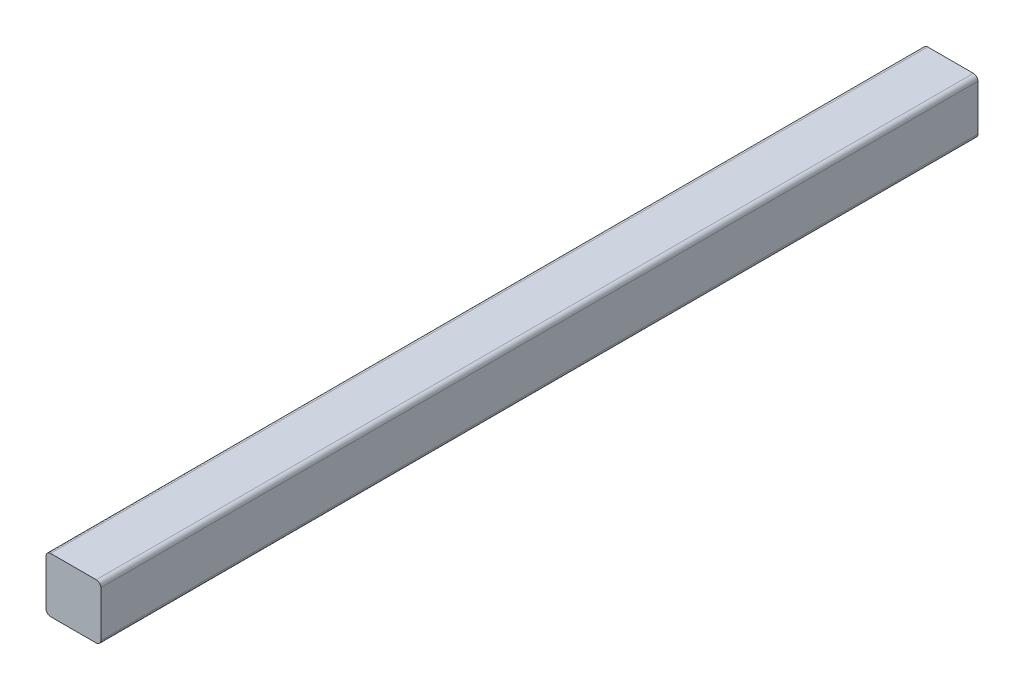
ISO-10303-21;
HEADER;
FILE_DESCRIPTION(('STEP AP214'),'2;1');
FILE_NAME('part.step','',(''),(''),'','','');
FILE_SCHEMA(('AUTOMOTIVE_DESIGN { 1 0 10303 214 1 1 1 1 }'));
ENDSEC;
DATA;
#1=APPLICATION_CONTEXT('core data for automotive mechanical design processes');
#2=APPLICATION_PROTOCOL_DEFINITION('international standard','automotive_design',2000,#1);
#3=PRODUCT_CONTEXT('',#1,'mechanical');
#4=PRODUCT('Part','Part','',(#3));
#5=PRODUCT_RELATED_PRODUCT_CATEGORY('part','',(#4));
#6=PRODUCT_DEFINITION_FORMATION('','',#4);
#7=PRODUCT_DEFINITION_CONTEXT('part definition',#1,'design');
#8=PRODUCT_DEFINITION('design','',#6,#7);
#9=PRODUCT_DEFINITION_SHAPE('','',#8);
#10=(LENGTH_UNIT() NAMED_UNIT(*) SI_UNIT(.MILLI.,.METRE.));
#11=(NAMED_UNIT(*) PLANE_ANGLE_UNIT() SI_UNIT($,.RADIAN.));
#12=(NAMED_UNIT(*) SI_UNIT($,.STERADIAN.) SOLID_ANGLE_UNIT());
#13=UNCERTAINTY_MEASURE_WITH_UNIT(LENGTH_MEASURE(1.E-05),#10,'distance_accuracy_value','');
#14=(GEOMETRIC_REPRESENTATION_CONTEXT(3) GLOBAL_UNCERTAINTY_ASSIGNED_CONTEXT((#13)) GLOBAL_UNIT_ASSIGNED_CONTEXT((#10,
#11,#12)) REPRESENTATION_CONTEXT('',''));
#15=CARTESIAN_POINT('',(0.,0.,0.));
#16=DIRECTION('',(0.,0.,1.));
#17=DIRECTION('',(1.,0.,0.));
#18=AXIS2_PLACEMENT_3D('',#15,#16,#17);
#19=CARTESIAN_POINT('',(19.05,-19.05,609.6));
#20=DIRECTION('',(-1.,0.,0.));
#21=DIRECTION('',(0.,0.,1.));
#22=AXIS2_PLACEMENT_3D('',#19,#20,#21);
#23=PLANE('',#22);
#24=DIRECTION('',(0.,1.,0.));
#25=VECTOR('',#24,1.);
#26=CARTESIAN_POINT('',(19.05,-19.05,609.6));
#27=LINE('',#26,#25);
#28=CARTESIAN_POINT('',(19.05,-15.875,609.6));
#29=VERTEX_POINT('',#28);
#30=CARTESIAN_POINT('',(19.05,15.875,609.6));
#31=VERTEX_POINT('',#30);
#32=EDGE_CURVE('E134',#29,#31,#27,.T.);
#33=ORIENTED_EDGE('',*,*,#32,.F.);
#34=DIRECTION('',(0.,0.,-1.));
#35=VECTOR('',#34,1.);
#36=CARTESIAN_POINT('',(19.05,-15.875,609.6));
#37=LINE('',#36,#35);
#38=CARTESIAN_POINT('',(19.05,-15.875,0.));
#39=VERTEX_POINT('',#38);
#40=EDGE_CURVE('E11',#29,#39,#37,.T.);
#41=ORIENTED_EDGE('',*,*,#40,.T.);
#42=DIRECTION('',(0.,1.,0.));
#43=VECTOR('',#42,1.);
#44=CARTESIAN_POINT('',(19.05,-19.05,0.));
#45=LINE('',#44,#43);
#46=CARTESIAN_POINT('',(19.05,15.875,0.));
#47=VERTEX_POINT('',#46);
#48=EDGE_CURVE('E136',#39,#47,#45,.T.);
#49=ORIENTED_EDGE('',*,*,#48,.T.);
#50=DIRECTION('',(0.,0.,-1.));
#51=VECTOR('',#50,1.);
#52=CARTESIAN_POINT('',(19.05,15.875,609.6));
#53=LINE('',#52,#51);
#54=EDGE_CURVE('E47',#47,#31,#53,.F.);
#55=ORIENTED_EDGE('',*,*,#54,.T.);
#56=EDGE_LOOP('',(#33,#41,#49,#55));
#57=FACE_BOUND('',#56,.T.);
#58=ADVANCED_FACE('F39',(#57),#23,.F.);
#59=CARTESIAN_POINT('',(-19.05,19.05,609.6));
#60=DIRECTION('',(0.,-1.,0.));
#61=DIRECTION('',(0.,0.,-1.));
#62=AXIS2_PLACEMENT_3D('',#59,#60,#61);
#63=PLANE('',#62);
#64=DIRECTION('',(-1.,0.,0.));
#65=VECTOR('',#64,1.);
#66=CARTESIAN_POINT('',(-19.05,19.05,0.));
#67=LINE('',#66,#65);
#68=CARTESIAN_POINT('',(15.875,19.05,0.));
#69=VERTEX_POINT('',#68);
#70=CARTESIAN_POINT('',(-15.875,19.05,0.));
#71=VERTEX_POINT('',#70);
#72=EDGE_CURVE('E132',#69,#71,#67,.T.);
#73=ORIENTED_EDGE('',*,*,#72,.T.);
#74=DIRECTION('',(0.,0.,-1.));
#75=VECTOR('',#74,1.);
#76=CARTESIAN_POINT('',(-15.875,19.05,609.6));
#77=LINE('',#76,#75);
#78=CARTESIAN_POINT('',(-15.875,19.05,609.6));
#79=VERTEX_POINT('',#78);
#80=EDGE_CURVE('E111',#71,#79,#77,.F.);
#81=ORIENTED_EDGE('',*,*,#80,.T.);
#82=DIRECTION('',(-1.,0.,0.));
#83=VECTOR('',#82,1.);
#84=CARTESIAN_POINT('',(-19.05,19.05,609.6));
#85=LINE('',#84,#83);
#86=CARTESIAN_POINT('',(15.875,19.05,609.6));
#87=VERTEX_POINT('',#86);
#88=EDGE_CURVE('E172',#87,#79,#85,.T.);
#89=ORIENTED_EDGE('',*,*,#88,.F.);
#90=DIRECTION('',(0.,0.,-1.));
#91=VECTOR('',#90,1.);
#92=CARTESIAN_POINT('',(15.875,19.05,609.6));
#93=LINE('',#92,#91);
#94=EDGE_CURVE('E116',#87,#69,#93,.T.);
#95=ORIENTED_EDGE('',*,*,#94,.T.);
#96=EDGE_LOOP('',(#73,#81,#89,#95));
#97=FACE_BOUND('',#96,.T.);
#98=ADVANCED_FACE('F176',(#97),#63,.F.);
#99=CARTESIAN_POINT('',(-19.05,-19.05,609.6));
#100=DIRECTION('',(1.,0.,0.));
#101=DIRECTION('',(0.,0.,-1.));
#102=AXIS2_PLACEMENT_3D('',#99,#100,#101);
#103=PLANE('',#102);
#104=DIRECTION('',(0.,-1.,0.));
#105=VECTOR('',#104,1.);
#106=CARTESIAN_POINT('',(-19.05,-19.05,609.6));
#107=LINE('',#106,#105);
#108=CARTESIAN_POINT('',(-19.05,15.875,609.6));
#109=VERTEX_POINT('',#108);
#110=CARTESIAN_POINT('',(-19.05,-15.875,609.6));
#111=VERTEX_POINT('',#110);
#112=EDGE_CURVE('E125',#109,#111,#107,.T.);
#113=ORIENTED_EDGE('',*,*,#112,.F.);
#114=DIRECTION('',(0.,0.,-1.));
#115=VECTOR('',#114,1.);
#116=CARTESIAN_POINT('',(-19.05,15.875,609.6));
#117=LINE('',#116,#115);
#118=CARTESIAN_POINT('',(-19.05,15.875,0.));
#119=VERTEX_POINT('',#118);
#120=EDGE_CURVE('E110',#109,#119,#117,.T.);
#121=ORIENTED_EDGE('',*,*,#120,.T.);
#122=DIRECTION('',(0.,-1.,0.));
#123=VECTOR('',#122,1.);
#124=CARTESIAN_POINT('',(-19.05,-19.05,0.));
#125=LINE('',#124,#123);
#126=CARTESIAN_POINT('',(-19.05,-15.875,0.));
#127=VERTEX_POINT('',#126);
#128=EDGE_CURVE('E123',#119,#127,#125,.T.);
#129=ORIENTED_EDGE('',*,*,#128,.T.);
#130=DIRECTION('',(0.,0.,-1.));
#131=VECTOR('',#130,1.);
#132=CARTESIAN_POINT('',(-19.05,-15.875,609.6));
#133=LINE('',#132,#131);
#134=EDGE_CURVE('E127',#127,#111,#133,.F.);
#135=ORIENTED_EDGE('',*,*,#134,.T.);
#136=EDGE_LOOP('',(#113,#121,#129,#135));
#137=FACE_BOUND('',#136,.T.);
#138=ADVANCED_FACE('F122',(#137),#103,.F.);
#139=CARTESIAN_POINT('',(-19.05,-19.05,609.6));
#140=DIRECTION('',(0.,1.,0.));
#141=DIRECTION('',(0.,0.,1.));
#142=AXIS2_PLACEMENT_3D('',#139,#140,#141);
#143=PLANE('',#142);
#144=DIRECTION('',(1.,0.,0.));
#145=VECTOR('',#144,1.);
#146=CARTESIAN_POINT('',(-19.05,-19.05,609.6));
#147=LINE('',#146,#145);
#148=CARTESIAN_POINT('',(-15.875,-19.05,609.6));
#149=VERTEX_POINT('',#148);
#150=CARTESIAN_POINT('',(15.875,-19.05,609.6));
#151=VERTEX_POINT('',#150);
#152=EDGE_CURVE('E140',#149,#151,#147,.T.);
#153=ORIENTED_EDGE('',*,*,#152,.F.);
#154=DIRECTION('',(0.,0.,-1.));
#155=VECTOR('',#154,1.);
#156=CARTESIAN_POINT('',(-15.875,-19.05,609.6));
#157=LINE('',#156,#155);
#158=CARTESIAN_POINT('',(-15.875,-19.05,0.));
#159=VERTEX_POINT('',#158);
#160=EDGE_CURVE('E157',#149,#159,#157,.T.);
#161=ORIENTED_EDGE('',*,*,#160,.T.);
#162=DIRECTION('',(1.,0.,0.));
#163=VECTOR('',#162,1.);
#164=CARTESIAN_POINT('',(-19.05,-19.05,0.));
#165=LINE('',#164,#163);
#166=CARTESIAN_POINT('',(15.875,-19.05,0.));
#167=VERTEX_POINT('',#166);
#168=EDGE_CURVE('E131',#159,#167,#165,.T.);
#169=ORIENTED_EDGE('',*,*,#168,.T.);
#170=DIRECTION('',(0.,0.,-1.));
#171=VECTOR('',#170,1.);
#172=CARTESIAN_POINT('',(15.875,-19.05,609.6));
#173=LINE('',#172,#171);
#174=EDGE_CURVE('E54',#167,#151,#173,.F.);
#175=ORIENTED_EDGE('',*,*,#174,.T.);
#176=EDGE_LOOP('',(#153,#161,#169,#175));
#177=FACE_BOUND('',#176,.T.);
#178=ADVANCED_FACE('F183',(#177),#143,.F.);
#179=CARTESIAN_POINT('',(0.,0.,609.6));
#180=DIRECTION('',(0.,0.,-1.));
#181=DIRECTION('',(-1.,0.,0.));
#182=AXIS2_PLACEMENT_3D('',#179,#180,#181);
#183=PLANE('',#182);
#184=ORIENTED_EDGE('',*,*,#88,.T.);
#185=CARTESIAN_POINT('',(-15.875,15.875,609.6));
#186=DIRECTION('',(0.,0.,-1.));
#187=DIRECTION('',(-1.,0.,0.));
#188=AXIS2_PLACEMENT_3D('',#185,#186,#187);
#189=CIRCLE('',#188,3.175);
#190=EDGE_CURVE('E154',#79,#109,#189,.F.);
#191=ORIENTED_EDGE('',*,*,#190,.T.);
#192=ORIENTED_EDGE('',*,*,#112,.T.);
#193=CARTESIAN_POINT('',(-15.875,-15.875,609.6));
#194=DIRECTION('',(0.,0.,-1.));
#195=DIRECTION('',(-1.,0.,0.));
#196=AXIS2_PLACEMENT_3D('',#193,#194,#195);
#197=CIRCLE('',#196,3.175);
#198=EDGE_CURVE('E61',#111,#149,#197,.F.);
#199=ORIENTED_EDGE('',*,*,#198,.T.);
#200=ORIENTED_EDGE('',*,*,#152,.T.);
#201=CARTESIAN_POINT('',(15.875,-15.875,609.6));
#202=DIRECTION('',(0.,0.,-1.));
#203=DIRECTION('',(-1.,0.,0.));
#204=AXIS2_PLACEMENT_3D('',#201,#202,#203);
#205=CIRCLE('',#204,3.175);
#206=EDGE_CURVE('E151',#151,#29,#205,.F.);
#207=ORIENTED_EDGE('',*,*,#206,.T.);
#208=ORIENTED_EDGE('',*,*,#32,.T.);
#209=CARTESIAN_POINT('',(15.875,15.875,609.6));
#210=DIRECTION('',(0.,0.,-1.));
#211=DIRECTION('',(-1.,0.,0.));
#212=AXIS2_PLACEMENT_3D('',#209,#210,#211);
#213=CIRCLE('',#212,3.175);
#214=EDGE_CURVE('E149',#31,#87,#213,.F.);
#215=ORIENTED_EDGE('',*,*,#214,.T.);
#216=EDGE_LOOP('',(#184,#191,#192,#199,#200,#207,#208,#215));
#217=FACE_BOUND('',#216,.T.);
#218=ADVANCED_FACE('F169',(#217),#183,.F.);
#219=CARTESIAN_POINT('',(0.,0.,0.));
#220=DIRECTION('',(0.,0.,-1.));
#221=DIRECTION('',(-1.,0.,0.));
#222=AXIS2_PLACEMENT_3D('',#219,#220,#221);
#223=PLANE('',#222);
#224=ORIENTED_EDGE('',*,*,#128,.F.);
#225=CARTESIAN_POINT('',(-15.875,15.875,0.));
#226=DIRECTION('',(0.,0.,-1.));
#227=DIRECTION('',(-1.,0.,0.));
#228=AXIS2_PLACEMENT_3D('',#225,#226,#227);
#229=CIRCLE('',#228,3.175);
#230=EDGE_CURVE('E106',#119,#71,#229,.T.);
#231=ORIENTED_EDGE('',*,*,#230,.T.);
#232=ORIENTED_EDGE('',*,*,#72,.F.);
#233=CARTESIAN_POINT('',(15.875,15.875,0.));
#234=DIRECTION('',(0.,0.,-1.));
#235=DIRECTION('',(-1.,0.,0.));
#236=AXIS2_PLACEMENT_3D('',#233,#234,#235);
#237=CIRCLE('',#236,3.175);
#238=EDGE_CURVE('E126',#69,#47,#237,.T.);
#239=ORIENTED_EDGE('',*,*,#238,.T.);
#240=ORIENTED_EDGE('',*,*,#48,.F.);
#241=CARTESIAN_POINT('',(15.875,-15.875,0.));
#242=DIRECTION('',(0.,0.,-1.));
#243=DIRECTION('',(-1.,0.,0.));
#244=AXIS2_PLACEMENT_3D('',#241,#242,#243);
#245=CIRCLE('',#244,3.175);
#246=EDGE_CURVE('E143',#39,#167,#245,.T.);
#247=ORIENTED_EDGE('',*,*,#246,.T.);
#248=ORIENTED_EDGE('',*,*,#168,.F.);
#249=CARTESIAN_POINT('',(-15.875,-15.875,0.));
#250=DIRECTION('',(0.,0.,-1.));
#251=DIRECTION('',(-1.,0.,0.));
#252=AXIS2_PLACEMENT_3D('',#249,#250,#251);
#253=CIRCLE('',#252,3.175);
#254=EDGE_CURVE('E117',#159,#127,#253,.T.);
#255=ORIENTED_EDGE('',*,*,#254,.T.);
#256=EDGE_LOOP('',(#224,#231,#232,#239,#240,#247,#248,#255));
#257=FACE_BOUND('',#256,.T.);
#258=ADVANCED_FACE('F129',(#257),#223,.T.);
#259=CARTESIAN_POINT('',(-15.875,15.875,609.6));
#260=DIRECTION('',(0.,0.,-1.));
#261=DIRECTION('',(-1.,0.,0.));
#262=AXIS2_PLACEMENT_3D('',#259,#260,#261);
#263=CYLINDRICAL_SURFACE('',#262,3.175);
#264=ORIENTED_EDGE('',*,*,#190,.F.);
#265=ORIENTED_EDGE('',*,*,#80,.F.);
#266=ORIENTED_EDGE('',*,*,#230,.F.);
#267=ORIENTED_EDGE('',*,*,#120,.F.);
#268=EDGE_LOOP('',(#264,#265,#266,#267));
#269=FACE_BOUND('',#268,.T.);
#270=ADVANCED_FACE('F109',(#269),#263,.T.);
#271=CARTESIAN_POINT('',(-15.875,-15.875,609.6));
#272=DIRECTION('',(0.,0.,-1.));
#273=DIRECTION('',(-1.,0.,0.));
#274=AXIS2_PLACEMENT_3D('',#271,#272,#273);
#275=CYLINDRICAL_SURFACE('',#274,3.175);
#276=ORIENTED_EDGE('',*,*,#198,.F.);
#277=ORIENTED_EDGE('',*,*,#134,.F.);
#278=ORIENTED_EDGE('',*,*,#254,.F.);
#279=ORIENTED_EDGE('',*,*,#160,.F.);
#280=EDGE_LOOP('',(#276,#277,#278,#279));
#281=FACE_BOUND('',#280,.T.);
#282=ADVANCED_FACE('F182',(#281),#275,.T.);
#283=CARTESIAN_POINT('',(15.875,-15.875,609.6));
#284=DIRECTION('',(0.,0.,-1.));
#285=DIRECTION('',(-1.,0.,0.));
#286=AXIS2_PLACEMENT_3D('',#283,#284,#285);
#287=CYLINDRICAL_SURFACE('',#286,3.175);
#288=ORIENTED_EDGE('',*,*,#206,.F.);
#289=ORIENTED_EDGE('',*,*,#174,.F.);
#290=ORIENTED_EDGE('',*,*,#246,.F.);
#291=ORIENTED_EDGE('',*,*,#40,.F.);
#292=EDGE_LOOP('',(#288,#289,#290,#291));
#293=FACE_BOUND('',#292,.T.);
#294=ADVANCED_FACE('F185',(#293),#287,.T.);
#295=CARTESIAN_POINT('',(15.875,15.875,609.6));
#296=DIRECTION('',(0.,0.,-1.));
#297=DIRECTION('',(-1.,0.,0.));
#298=AXIS2_PLACEMENT_3D('',#295,#296,#297);
#299=CYLINDRICAL_SURFACE('',#298,3.175);
#300=ORIENTED_EDGE('',*,*,#214,.F.);
#301=ORIENTED_EDGE('',*,*,#54,.F.);
#302=ORIENTED_EDGE('',*,*,#238,.F.);
#303=ORIENTED_EDGE('',*,*,#94,.F.);
#304=EDGE_LOOP('',(#300,#301,#302,#303));
#305=FACE_BOUND('',#304,.T.);
#306=ADVANCED_FACE('F41',(#305),#299,.T.);
#307=CLOSED_SHELL('',(#58,#98,#138,#178,#218,#258,#270,#282,#294,#306));
#308=MANIFOLD_SOLID_BREP('B2',#307);
#309=ADVANCED_BREP_SHAPE_REPRESENTATION('',(#18,#308),#14);
#310=SHAPE_DEFINITION_REPRESENTATION(#9,#309);
ENDSEC;
END-ISO-10303-21;
